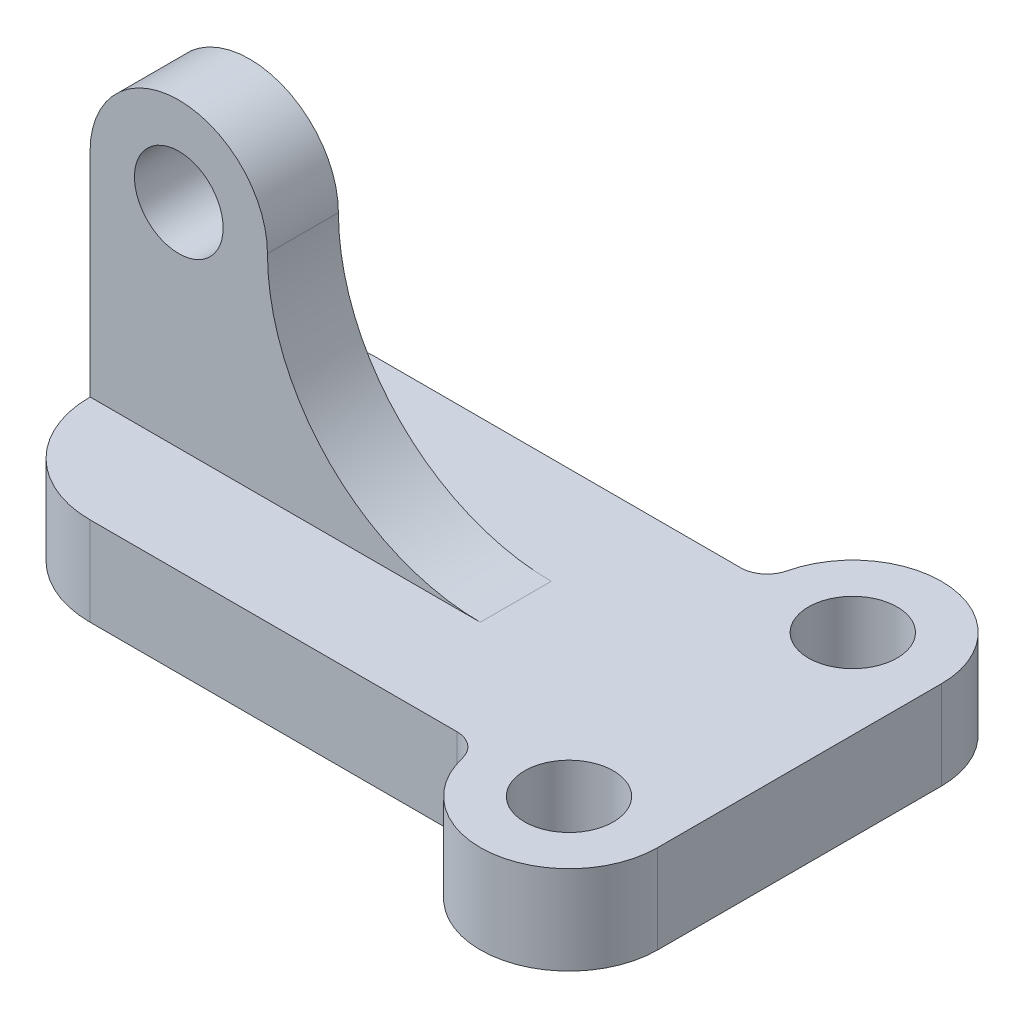
ISO-10303-21;
HEADER;
FILE_DESCRIPTION(('STEP AP214'),'2;1');
FILE_NAME('part.step','',(''),(''),'','','');
FILE_SCHEMA(('AUTOMOTIVE_DESIGN { 1 0 10303 214 1 1 1 1 }'));
ENDSEC;
DATA;
#1=APPLICATION_CONTEXT('core data for automotive mechanical design processes');
#2=APPLICATION_PROTOCOL_DEFINITION('international standard','automotive_design',2000,#1);
#3=PRODUCT_CONTEXT('',#1,'mechanical');
#4=PRODUCT('Part','Part','',(#3));
#5=PRODUCT_RELATED_PRODUCT_CATEGORY('part','',(#4));
#6=PRODUCT_DEFINITION_FORMATION('','',#4);
#7=PRODUCT_DEFINITION_CONTEXT('part definition',#1,'design');
#8=PRODUCT_DEFINITION('design','',#6,#7);
#9=PRODUCT_DEFINITION_SHAPE('','',#8);
#10=(LENGTH_UNIT() NAMED_UNIT(*) SI_UNIT(.MILLI.,.METRE.));
#11=(NAMED_UNIT(*) PLANE_ANGLE_UNIT() SI_UNIT($,.RADIAN.));
#12=(NAMED_UNIT(*) SI_UNIT($,.STERADIAN.) SOLID_ANGLE_UNIT());
#13=UNCERTAINTY_MEASURE_WITH_UNIT(LENGTH_MEASURE(1.E-05),#10,'distance_accuracy_value','');
#14=(GEOMETRIC_REPRESENTATION_CONTEXT(3) GLOBAL_UNCERTAINTY_ASSIGNED_CONTEXT((#13)) GLOBAL_UNIT_ASSIGNED_CONTEXT((#10,
#11,#12)) REPRESENTATION_CONTEXT('',''));
#15=CARTESIAN_POINT('',(0.,0.,0.));
#16=DIRECTION('',(0.,0.,1.));
#17=DIRECTION('',(1.,0.,0.));
#18=AXIS2_PLACEMENT_3D('',#15,#16,#17);
#19=CARTESIAN_POINT('',(44.,34.,-12.));
#20=DIRECTION('',(0.,0.,-1.));
#21=DIRECTION('',(-1.,0.,0.));
#22=AXIS2_PLACEMENT_3D('',#19,#20,#21);
#23=CYLINDRICAL_SURFACE('',#22,24.);
#24=DIRECTION('',(0.,0.,-1.));
#25=VECTOR('',#24,1.);
#26=CARTESIAN_POINT('',(44.,10.,0.));
#27=LINE('',#26,#25);
#28=CARTESIAN_POINT('',(44.,10.,-20.));
#29=VERTEX_POINT('',#28);
#30=CARTESIAN_POINT('',(44.,10.,-12.));
#31=VERTEX_POINT('',#30);
#32=EDGE_CURVE('E135',#29,#31,#27,.F.);
#33=ORIENTED_EDGE('',*,*,#32,.F.);
#34=CARTESIAN_POINT('',(44.,34.,-20.));
#35=DIRECTION('',(0.,0.,-1.));
#36=DIRECTION('',(-1.,0.,0.));
#37=AXIS2_PLACEMENT_3D('',#34,#35,#36);
#38=CIRCLE('',#37,24.);
#39=CARTESIAN_POINT('',(20.,34.,-20.));
#40=VERTEX_POINT('',#39);
#41=EDGE_CURVE('E11',#29,#40,#38,.T.);
#42=ORIENTED_EDGE('',*,*,#41,.T.);
#43=DIRECTION('',(0.,0.,-1.));
#44=VECTOR('',#43,1.);
#45=CARTESIAN_POINT('',(20.,34.,-12.));
#46=LINE('',#45,#44);
#47=CARTESIAN_POINT('',(20.,34.,-12.));
#48=VERTEX_POINT('',#47);
#49=EDGE_CURVE('E137',#48,#40,#46,.T.);
#50=ORIENTED_EDGE('',*,*,#49,.F.);
#51=CARTESIAN_POINT('',(44.,34.,-12.));
#52=DIRECTION('',(0.,0.,-1.));
#53=DIRECTION('',(-1.,0.,0.));
#54=AXIS2_PLACEMENT_3D('',#51,#52,#53);
#55=CIRCLE('',#54,24.);
#56=EDGE_CURVE('E43',#48,#31,#55,.F.);
#57=ORIENTED_EDGE('',*,*,#56,.T.);
#58=EDGE_LOOP('',(#33,#42,#50,#57));
#59=FACE_BOUND('',#58,.T.);
#60=ADVANCED_FACE('F36',(#59),#23,.F.);
#61=CARTESIAN_POINT('',(0.,10.,0.));
#62=DIRECTION('',(0.,1.,0.));
#63=DIRECTION('',(0.,0.,1.));
#64=AXIS2_PLACEMENT_3D('',#61,#62,#63);
#65=PLANE('',#64);
#66=CARTESIAN_POINT('',(66.,10.,0.));
#67=DIRECTION('',(0.,1.,0.));
#68=DIRECTION('',(0.,0.,1.));
#69=AXIS2_PLACEMENT_3D('',#66,#67,#68);
#70=CIRCLE('',#69,5.);
#71=CARTESIAN_POINT('',(66.,10.,5.));
#72=VERTEX_POINT('',#71);
#73=EDGE_CURVE('E163',#72,#72,#70,.F.);
#74=ORIENTED_EDGE('',*,*,#73,.T.);
#75=EDGE_LOOP('',(#74));
#76=FACE_BOUND('',#75,.T.);
#77=CARTESIAN_POINT('',(66.,10.,-32.));
#78=DIRECTION('',(0.,1.,0.));
#79=DIRECTION('',(0.,0.,1.));
#80=AXIS2_PLACEMENT_3D('',#77,#78,#79);
#81=CIRCLE('',#80,5.00000000000001);
#82=CARTESIAN_POINT('',(66.,10.,-27.));
#83=VERTEX_POINT('',#82);
#84=EDGE_CURVE('E160',#83,#83,#81,.T.);
#85=ORIENTED_EDGE('',*,*,#84,.F.);
#86=EDGE_LOOP('',(#85));
#87=FACE_BOUND('',#86,.T.);
#88=ORIENTED_EDGE('',*,*,#32,.T.);
#89=DIRECTION('',(1.,0.,0.));
#90=VECTOR('',#89,1.);
#91=CARTESIAN_POINT('',(0.,10.,-12.));
#92=LINE('',#91,#90);
#93=CARTESIAN_POINT('',(0.,10.,-12.));
#94=VERTEX_POINT('',#93);
#95=EDGE_CURVE('E50',#94,#31,#92,.T.);
#96=ORIENTED_EDGE('',*,*,#95,.F.);
#97=CARTESIAN_POINT('',(12.,10.,-12.));
#98=DIRECTION('',(0.,1.,0.));
#99=DIRECTION('',(0.,0.,1.));
#100=AXIS2_PLACEMENT_3D('',#97,#98,#99);
#101=CIRCLE('',#100,12.);
#102=CARTESIAN_POINT('',(12.,10.,0.));
#103=VERTEX_POINT('',#102);
#104=EDGE_CURVE('E242',#94,#103,#101,.T.);
#105=ORIENTED_EDGE('',*,*,#104,.T.);
#106=DIRECTION('',(1.,0.,0.));
#107=VECTOR('',#106,1.);
#108=CARTESIAN_POINT('',(0.,10.,0.));
#109=LINE('',#108,#107);
#110=CARTESIAN_POINT('',(53.3508893593265,10.,0.));
#111=VERTEX_POINT('',#110);
#112=EDGE_CURVE('E178',#103,#111,#109,.T.);
#113=ORIENTED_EDGE('',*,*,#112,.T.);
#114=CARTESIAN_POINT('',(53.3508893593265,10.,3.));
#115=DIRECTION('',(0.,1.,0.));
#116=DIRECTION('',(0.,0.,1.));
#117=AXIS2_PLACEMENT_3D('',#114,#115,#116);
#118=CIRCLE('',#117,3.);
#119=CARTESIAN_POINT('',(56.2699148917896,10.,2.3076923076923));
#120=VERTEX_POINT('',#119);
#121=EDGE_CURVE('E212',#120,#111,#118,.T.);
#122=ORIENTED_EDGE('',*,*,#121,.F.);
#123=CARTESIAN_POINT('',(66.,10.,0.));
#124=DIRECTION('',(0.,1.,0.));
#125=DIRECTION('',(0.,0.,1.));
#126=AXIS2_PLACEMENT_3D('',#123,#124,#125);
#127=CIRCLE('',#126,10.);
#128=CARTESIAN_POINT('',(76.,10.,0.));
#129=VERTEX_POINT('',#128);
#130=EDGE_CURVE('E167',#129,#120,#127,.F.);
#131=ORIENTED_EDGE('',*,*,#130,.F.);
#132=DIRECTION('',(0.,0.,1.));
#133=VECTOR('',#132,1.);
#134=CARTESIAN_POINT('',(76.,10.,0.));
#135=LINE('',#134,#133);
#136=CARTESIAN_POINT('',(76.,10.,-32.));
#137=VERTEX_POINT('',#136);
#138=EDGE_CURVE('E170',#137,#129,#135,.T.);
#139=ORIENTED_EDGE('',*,*,#138,.F.);
#140=CARTESIAN_POINT('',(66.,10.,-32.));
#141=DIRECTION('',(0.,1.,0.));
#142=DIRECTION('',(0.,0.,1.));
#143=AXIS2_PLACEMENT_3D('',#140,#141,#142);
#144=CIRCLE('',#143,10.);
#145=CARTESIAN_POINT('',(56.2699148917896,10.,-34.3076923076923));
#146=VERTEX_POINT('',#145);
#147=EDGE_CURVE('E173',#137,#146,#144,.T.);
#148=ORIENTED_EDGE('',*,*,#147,.T.);
#149=CARTESIAN_POINT('',(53.3508893593265,10.,-35.));
#150=DIRECTION('',(0.,1.,0.));
#151=DIRECTION('',(0.,0.,1.));
#152=AXIS2_PLACEMENT_3D('',#149,#150,#151);
#153=CIRCLE('',#152,3.);
#154=CARTESIAN_POINT('',(53.3508893593265,10.,-32.));
#155=VERTEX_POINT('',#154);
#156=EDGE_CURVE('E221',#155,#146,#153,.T.);
#157=ORIENTED_EDGE('',*,*,#156,.F.);
#158=DIRECTION('',(1.,0.,0.));
#159=VECTOR('',#158,1.);
#160=CARTESIAN_POINT('',(0.,10.,-32.));
#161=LINE('',#160,#159);
#162=CARTESIAN_POINT('',(12.,10.,-32.));
#163=VERTEX_POINT('',#162);
#164=EDGE_CURVE('E176',#163,#155,#161,.T.);
#165=ORIENTED_EDGE('',*,*,#164,.F.);
#166=CARTESIAN_POINT('',(12.,10.,-20.));
#167=DIRECTION('',(0.,1.,0.));
#168=DIRECTION('',(0.,0.,1.));
#169=AXIS2_PLACEMENT_3D('',#166,#167,#168);
#170=CIRCLE('',#169,12.);
#171=CARTESIAN_POINT('',(0.,10.,-20.));
#172=VERTEX_POINT('',#171);
#173=EDGE_CURVE('E234',#163,#172,#170,.T.);
#174=ORIENTED_EDGE('',*,*,#173,.T.);
#175=DIRECTION('',(1.,0.,0.));
#176=VECTOR('',#175,1.);
#177=CARTESIAN_POINT('',(0.,10.,-20.));
#178=LINE('',#177,#176);
#179=EDGE_CURVE('E58',#172,#29,#178,.T.);
#180=ORIENTED_EDGE('',*,*,#179,.T.);
#181=EDGE_LOOP('',(#88,#96,#105,#113,#122,#131,#139,#148,#157,#165,#174,#180));
#182=FACE_BOUND('',#181,.T.);
#183=ADVANCED_FACE('F246',(#76,#87,#182),#65,.T.);
#184=CARTESIAN_POINT('',(12.,10.,-12.));
#185=DIRECTION('',(0.,-1.,0.));
#186=DIRECTION('',(0.,0.,-1.));
#187=AXIS2_PLACEMENT_3D('',#184,#185,#186);
#188=CYLINDRICAL_SURFACE('',#187,12.);
#189=DIRECTION('',(0.,-1.,0.));
#190=VECTOR('',#189,1.);
#191=CARTESIAN_POINT('',(12.,10.,0.));
#192=LINE('',#191,#190);
#193=CARTESIAN_POINT('',(12.,0.,0.));
#194=VERTEX_POINT('',#193);
#195=EDGE_CURVE('E236',#103,#194,#192,.T.);
#196=ORIENTED_EDGE('',*,*,#195,.F.);
#197=ORIENTED_EDGE('',*,*,#104,.F.);
#198=DIRECTION('',(0.,-1.,0.));
#199=VECTOR('',#198,1.);
#200=CARTESIAN_POINT('',(0.,10.,-12.));
#201=LINE('',#200,#199);
#202=CARTESIAN_POINT('',(0.,0.,-12.));
#203=VERTEX_POINT('',#202);
#204=EDGE_CURVE('E239',#203,#94,#201,.F.);
#205=ORIENTED_EDGE('',*,*,#204,.F.);
#206=CARTESIAN_POINT('',(12.,0.,-12.));
#207=DIRECTION('',(0.,1.,0.));
#208=DIRECTION('',(0.,0.,1.));
#209=AXIS2_PLACEMENT_3D('',#206,#207,#208);
#210=CIRCLE('',#209,12.);
#211=EDGE_CURVE('E244',#194,#203,#210,.F.);
#212=ORIENTED_EDGE('',*,*,#211,.F.);
#213=EDGE_LOOP('',(#196,#197,#205,#212));
#214=FACE_BOUND('',#213,.T.);
#215=ADVANCED_FACE('F251',(#214),#188,.T.);
#216=CARTESIAN_POINT('',(12.,10.,-20.));
#217=DIRECTION('',(0.,-1.,0.));
#218=DIRECTION('',(0.,0.,-1.));
#219=AXIS2_PLACEMENT_3D('',#216,#217,#218);
#220=CYLINDRICAL_SURFACE('',#219,12.);
#221=DIRECTION('',(0.,1.,0.));
#222=VECTOR('',#221,1.);
#223=CARTESIAN_POINT('',(12.,10.,-32.));
#224=LINE('',#223,#222);
#225=CARTESIAN_POINT('',(12.,0.,-32.));
#226=VERTEX_POINT('',#225);
#227=EDGE_CURVE('E226',#226,#163,#224,.T.);
#228=ORIENTED_EDGE('',*,*,#227,.F.);
#229=CARTESIAN_POINT('',(12.,0.,-20.));
#230=DIRECTION('',(0.,1.,0.));
#231=DIRECTION('',(0.,0.,1.));
#232=AXIS2_PLACEMENT_3D('',#229,#230,#231);
#233=CIRCLE('',#232,12.);
#234=CARTESIAN_POINT('',(0.,0.,-20.));
#235=VERTEX_POINT('',#234);
#236=EDGE_CURVE('E232',#235,#226,#233,.F.);
#237=ORIENTED_EDGE('',*,*,#236,.F.);
#238=DIRECTION('',(0.,1.,0.));
#239=VECTOR('',#238,1.);
#240=CARTESIAN_POINT('',(0.,10.,-20.));
#241=LINE('',#240,#239);
#242=EDGE_CURVE('E229',#172,#235,#241,.F.);
#243=ORIENTED_EDGE('',*,*,#242,.F.);
#244=ORIENTED_EDGE('',*,*,#173,.F.);
#245=EDGE_LOOP('',(#228,#237,#243,#244));
#246=FACE_BOUND('',#245,.T.);
#247=ADVANCED_FACE('F290',(#246),#220,.T.);
#248=CARTESIAN_POINT('',(53.3508893593265,10.,-35.));
#249=DIRECTION('',(0.,-1.,0.));
#250=DIRECTION('',(0.,0.,-1.));
#251=AXIS2_PLACEMENT_3D('',#248,#249,#250);
#252=CYLINDRICAL_SURFACE('',#251,3.);
#253=DIRECTION('',(0.,-1.,0.));
#254=VECTOR('',#253,1.);
#255=CARTESIAN_POINT('',(53.3508893593265,10.,-32.));
#256=LINE('',#255,#254);
#257=CARTESIAN_POINT('',(53.3508893593265,0.,-32.));
#258=VERTEX_POINT('',#257);
#259=EDGE_CURVE('E215',#155,#258,#256,.T.);
#260=ORIENTED_EDGE('',*,*,#259,.F.);
#261=ORIENTED_EDGE('',*,*,#156,.T.);
#262=DIRECTION('',(0.,-1.,0.));
#263=VECTOR('',#262,1.);
#264=CARTESIAN_POINT('',(56.2699148917896,10.,-34.3076923076923));
#265=LINE('',#264,#263);
#266=CARTESIAN_POINT('',(56.2699148917896,0.,-34.3076923076923));
#267=VERTEX_POINT('',#266);
#268=EDGE_CURVE('E218',#267,#146,#265,.F.);
#269=ORIENTED_EDGE('',*,*,#268,.F.);
#270=CARTESIAN_POINT('',(53.3508893593265,0.,-35.));
#271=DIRECTION('',(0.,1.,0.));
#272=DIRECTION('',(0.,0.,1.));
#273=AXIS2_PLACEMENT_3D('',#270,#271,#272);
#274=CIRCLE('',#273,3.);
#275=EDGE_CURVE('E223',#267,#258,#274,.F.);
#276=ORIENTED_EDGE('',*,*,#275,.T.);
#277=EDGE_LOOP('',(#260,#261,#269,#276));
#278=FACE_BOUND('',#277,.T.);
#279=ADVANCED_FACE('F285',(#278),#252,.F.);
#280=CARTESIAN_POINT('',(53.3508893593265,10.,3.));
#281=DIRECTION('',(0.,-1.,0.));
#282=DIRECTION('',(0.,0.,-1.));
#283=AXIS2_PLACEMENT_3D('',#280,#281,#282);
#284=CYLINDRICAL_SURFACE('',#283,3.);
#285=DIRECTION('',(0.,-1.,0.));
#286=VECTOR('',#285,1.);
#287=CARTESIAN_POINT('',(53.3508893593265,10.,0.));
#288=LINE('',#287,#286);
#289=CARTESIAN_POINT('',(53.3508893593265,0.,0.));
#290=VERTEX_POINT('',#289);
#291=EDGE_CURVE('E204',#290,#111,#288,.F.);
#292=ORIENTED_EDGE('',*,*,#291,.F.);
#293=CARTESIAN_POINT('',(53.3508893593265,0.,3.));
#294=DIRECTION('',(0.,1.,0.));
#295=DIRECTION('',(0.,0.,1.));
#296=AXIS2_PLACEMENT_3D('',#293,#294,#295);
#297=CIRCLE('',#296,3.);
#298=CARTESIAN_POINT('',(56.2699148917896,0.,2.3076923076923));
#299=VERTEX_POINT('',#298);
#300=EDGE_CURVE('E210',#290,#299,#297,.F.);
#301=ORIENTED_EDGE('',*,*,#300,.T.);
#302=DIRECTION('',(0.,-1.,0.));
#303=VECTOR('',#302,1.);
#304=CARTESIAN_POINT('',(56.2699148917896,10.,2.30769230769231));
#305=LINE('',#304,#303);
#306=EDGE_CURVE('E207',#120,#299,#305,.T.);
#307=ORIENTED_EDGE('',*,*,#306,.F.);
#308=ORIENTED_EDGE('',*,*,#121,.T.);
#309=EDGE_LOOP('',(#292,#301,#307,#308));
#310=FACE_BOUND('',#309,.T.);
#311=ADVANCED_FACE('F268',(#310),#284,.F.);
#312=CARTESIAN_POINT('',(66.,10.,0.));
#313=DIRECTION('',(0.,-1.,0.));
#314=DIRECTION('',(0.,0.,-1.));
#315=AXIS2_PLACEMENT_3D('',#312,#313,#314);
#316=CYLINDRICAL_SURFACE('',#315,10.);
#317=ORIENTED_EDGE('',*,*,#130,.T.);
#318=ORIENTED_EDGE('',*,*,#306,.T.);
#319=CARTESIAN_POINT('',(66.,0.,0.));
#320=DIRECTION('',(0.,1.,0.));
#321=DIRECTION('',(0.,0.,1.));
#322=AXIS2_PLACEMENT_3D('',#319,#320,#321);
#323=CIRCLE('',#322,10.);
#324=CARTESIAN_POINT('',(76.,0.,0.));
#325=VERTEX_POINT('',#324);
#326=EDGE_CURVE('E186',#325,#299,#323,.F.);
#327=ORIENTED_EDGE('',*,*,#326,.F.);
#328=DIRECTION('',(0.,-1.,0.));
#329=VECTOR('',#328,1.);
#330=CARTESIAN_POINT('',(76.,10.,0.));
#331=LINE('',#330,#329);
#332=EDGE_CURVE('E202',#129,#325,#331,.T.);
#333=ORIENTED_EDGE('',*,*,#332,.F.);
#334=EDGE_LOOP('',(#317,#318,#327,#333));
#335=FACE_BOUND('',#334,.T.);
#336=ADVANCED_FACE('F271',(#335),#316,.T.);
#337=CARTESIAN_POINT('',(76.,10.,0.));
#338=DIRECTION('',(1.,0.,0.));
#339=DIRECTION('',(0.,0.,-1.));
#340=AXIS2_PLACEMENT_3D('',#337,#338,#339);
#341=PLANE('',#340);
#342=DIRECTION('',(0.,0.,1.));
#343=VECTOR('',#342,1.);
#344=CARTESIAN_POINT('',(76.,0.,0.));
#345=LINE('',#344,#343);
#346=CARTESIAN_POINT('',(76.,0.,-32.));
#347=VERTEX_POINT('',#346);
#348=EDGE_CURVE('E189',#347,#325,#345,.T.);
#349=ORIENTED_EDGE('',*,*,#348,.F.);
#350=DIRECTION('',(0.,-1.,0.));
#351=VECTOR('',#350,1.);
#352=CARTESIAN_POINT('',(76.,10.,-32.));
#353=LINE('',#352,#351);
#354=EDGE_CURVE('E180',#137,#347,#353,.T.);
#355=ORIENTED_EDGE('',*,*,#354,.F.);
#356=ORIENTED_EDGE('',*,*,#138,.T.);
#357=ORIENTED_EDGE('',*,*,#332,.T.);
#358=EDGE_LOOP('',(#349,#355,#356,#357));
#359=FACE_BOUND('',#358,.T.);
#360=ADVANCED_FACE('F275',(#359),#341,.T.);
#361=CARTESIAN_POINT('',(66.,10.,-32.));
#362=DIRECTION('',(0.,-1.,0.));
#363=DIRECTION('',(0.,0.,-1.));
#364=AXIS2_PLACEMENT_3D('',#361,#362,#363);
#365=CYLINDRICAL_SURFACE('',#364,10.);
#366=CARTESIAN_POINT('',(66.,0.,-32.));
#367=DIRECTION('',(0.,1.,0.));
#368=DIRECTION('',(0.,0.,1.));
#369=AXIS2_PLACEMENT_3D('',#366,#367,#368);
#370=CIRCLE('',#369,10.);
#371=EDGE_CURVE('E192',#347,#267,#370,.T.);
#372=ORIENTED_EDGE('',*,*,#371,.T.);
#373=ORIENTED_EDGE('',*,*,#268,.T.);
#374=ORIENTED_EDGE('',*,*,#147,.F.);
#375=ORIENTED_EDGE('',*,*,#354,.T.);
#376=EDGE_LOOP('',(#372,#373,#374,#375));
#377=FACE_BOUND('',#376,.T.);
#378=ADVANCED_FACE('F279',(#377),#365,.T.);
#379=CARTESIAN_POINT('',(0.,10.,-32.));
#380=DIRECTION('',(0.,0.,-1.));
#381=DIRECTION('',(-1.,0.,0.));
#382=AXIS2_PLACEMENT_3D('',#379,#380,#381);
#383=PLANE('',#382);
#384=DIRECTION('',(1.,0.,0.));
#385=VECTOR('',#384,1.);
#386=CARTESIAN_POINT('',(0.,0.,-32.));
#387=LINE('',#386,#385);
#388=EDGE_CURVE('E195',#226,#258,#387,.T.);
#389=ORIENTED_EDGE('',*,*,#388,.F.);
#390=ORIENTED_EDGE('',*,*,#227,.T.);
#391=ORIENTED_EDGE('',*,*,#164,.T.);
#392=ORIENTED_EDGE('',*,*,#259,.T.);
#393=EDGE_LOOP('',(#389,#390,#391,#392));
#394=FACE_BOUND('',#393,.T.);
#395=ADVANCED_FACE('F288',(#394),#383,.T.);
#396=CARTESIAN_POINT('',(0.,10.,0.));
#397=DIRECTION('',(1.,0.,0.));
#398=DIRECTION('',(0.,0.,-1.));
#399=AXIS2_PLACEMENT_3D('',#396,#397,#398);
#400=PLANE('',#399);
#401=DIRECTION('',(0.,0.,1.));
#402=VECTOR('',#401,1.);
#403=CARTESIAN_POINT('',(0.,0.,0.));
#404=LINE('',#403,#402);
#405=EDGE_CURVE('E197',#235,#203,#404,.T.);
#406=ORIENTED_EDGE('',*,*,#405,.T.);
#407=ORIENTED_EDGE('',*,*,#204,.T.);
#408=DIRECTION('',(0.,-1.,0.));
#409=VECTOR('',#408,1.);
#410=CARTESIAN_POINT('',(0.,10.,-12.));
#411=LINE('',#410,#409);
#412=CARTESIAN_POINT('',(0.,34.,-12.));
#413=VERTEX_POINT('',#412);
#414=EDGE_CURVE('E146',#413,#94,#411,.T.);
#415=ORIENTED_EDGE('',*,*,#414,.F.);
#416=DIRECTION('',(0.,0.,-1.));
#417=VECTOR('',#416,1.);
#418=CARTESIAN_POINT('',(0.,34.,-12.));
#419=LINE('',#418,#417);
#420=CARTESIAN_POINT('',(0.,34.,-20.));
#421=VERTEX_POINT('',#420);
#422=EDGE_CURVE('E141',#413,#421,#419,.T.);
#423=ORIENTED_EDGE('',*,*,#422,.T.);
#424=DIRECTION('',(0.,-1.,0.));
#425=VECTOR('',#424,1.);
#426=CARTESIAN_POINT('',(0.,10.,-20.));
#427=LINE('',#426,#425);
#428=EDGE_CURVE('E149',#421,#172,#427,.T.);
#429=ORIENTED_EDGE('',*,*,#428,.T.);
#430=ORIENTED_EDGE('',*,*,#242,.T.);
#431=EDGE_LOOP('',(#406,#407,#415,#423,#429,#430));
#432=FACE_BOUND('',#431,.T.);
#433=ADVANCED_FACE('F254',(#432),#400,.F.);
#434=CARTESIAN_POINT('',(66.,10.,0.));
#435=DIRECTION('',(0.,-1.,0.));
#436=DIRECTION('',(0.,0.,-1.));
#437=AXIS2_PLACEMENT_3D('',#434,#435,#436);
#438=CYLINDRICAL_SURFACE('',#437,5.);
#439=ORIENTED_EDGE('',*,*,#73,.F.);
#440=EDGE_LOOP('',(#439));
#441=FACE_BOUND('',#440,.T.);
#442=CARTESIAN_POINT('',(66.,0.,0.));
#443=DIRECTION('',(0.,1.,0.));
#444=DIRECTION('',(0.,0.,1.));
#445=AXIS2_PLACEMENT_3D('',#442,#443,#444);
#446=CIRCLE('',#445,5.);
#447=CARTESIAN_POINT('',(66.,0.,5.));
#448=VERTEX_POINT('',#447);
#449=EDGE_CURVE('E183',#448,#448,#446,.F.);
#450=ORIENTED_EDGE('',*,*,#449,.T.);
#451=EDGE_LOOP('',(#450));
#452=FACE_BOUND('',#451,.T.);
#453=ADVANCED_FACE('F331',(#441,#452),#438,.F.);
#454=CARTESIAN_POINT('',(66.,10.,-32.));
#455=DIRECTION('',(0.,-1.,0.));
#456=DIRECTION('',(0.,0.,-1.));
#457=AXIS2_PLACEMENT_3D('',#454,#455,#456);
#458=CYLINDRICAL_SURFACE('',#457,5.00000000000001);
#459=ORIENTED_EDGE('',*,*,#84,.T.);
#460=EDGE_LOOP('',(#459));
#461=FACE_BOUND('',#460,.T.);
#462=CARTESIAN_POINT('',(66.,0.,-32.));
#463=DIRECTION('',(0.,1.,0.));
#464=DIRECTION('',(0.,0.,1.));
#465=AXIS2_PLACEMENT_3D('',#462,#463,#464);
#466=CIRCLE('',#465,5.00000000000001);
#467=CARTESIAN_POINT('',(66.,0.,-27.));
#468=VERTEX_POINT('',#467);
#469=EDGE_CURVE('E140',#468,#468,#466,.T.);
#470=ORIENTED_EDGE('',*,*,#469,.F.);
#471=EDGE_LOOP('',(#470));
#472=FACE_BOUND('',#471,.T.);
#473=ADVANCED_FACE('F328',(#461,#472),#458,.F.);
#474=CARTESIAN_POINT('',(0.,10.,0.));
#475=DIRECTION('',(0.,0.,-1.));
#476=DIRECTION('',(-1.,0.,0.));
#477=AXIS2_PLACEMENT_3D('',#474,#475,#476);
#478=PLANE('',#477);
#479=ORIENTED_EDGE('',*,*,#112,.F.);
#480=ORIENTED_EDGE('',*,*,#195,.T.);
#481=DIRECTION('',(1.,0.,0.));
#482=VECTOR('',#481,1.);
#483=CARTESIAN_POINT('',(0.,0.,0.));
#484=LINE('',#483,#482);
#485=EDGE_CURVE('E164',#194,#290,#484,.T.);
#486=ORIENTED_EDGE('',*,*,#485,.T.);
#487=ORIENTED_EDGE('',*,*,#291,.T.);
#488=EDGE_LOOP('',(#479,#480,#486,#487));
#489=FACE_BOUND('',#488,.T.);
#490=ADVANCED_FACE('F263',(#489),#478,.F.);
#491=CARTESIAN_POINT('',(0.,0.,0.));
#492=DIRECTION('',(0.,1.,0.));
#493=DIRECTION('',(0.,0.,1.));
#494=AXIS2_PLACEMENT_3D('',#491,#492,#493);
#495=PLANE('',#494);
#496=ORIENTED_EDGE('',*,*,#469,.T.);
#497=EDGE_LOOP('',(#496));
#498=FACE_BOUND('',#497,.T.);
#499=ORIENTED_EDGE('',*,*,#449,.F.);
#500=EDGE_LOOP('',(#499));
#501=FACE_BOUND('',#500,.T.);
#502=ORIENTED_EDGE('',*,*,#485,.F.);
#503=ORIENTED_EDGE('',*,*,#211,.T.);
#504=ORIENTED_EDGE('',*,*,#405,.F.);
#505=ORIENTED_EDGE('',*,*,#236,.T.);
#506=ORIENTED_EDGE('',*,*,#388,.T.);
#507=ORIENTED_EDGE('',*,*,#275,.F.);
#508=ORIENTED_EDGE('',*,*,#371,.F.);
#509=ORIENTED_EDGE('',*,*,#348,.T.);
#510=ORIENTED_EDGE('',*,*,#326,.T.);
#511=ORIENTED_EDGE('',*,*,#300,.F.);
#512=EDGE_LOOP('',(#502,#503,#504,#505,#506,#507,#508,#509,#510,#511));
#513=FACE_BOUND('',#512,.T.);
#514=ADVANCED_FACE('F259',(#498,#501,#513),#495,.F.);
#515=CARTESIAN_POINT('',(9.99999999999996,34.,-12.));
#516=DIRECTION('',(0.,0.,-1.));
#517=DIRECTION('',(-1.,0.,0.));
#518=AXIS2_PLACEMENT_3D('',#515,#516,#517);
#519=PLANE('',#518);
#520=ORIENTED_EDGE('',*,*,#95,.T.);
#521=ORIENTED_EDGE('',*,*,#56,.F.);
#522=CARTESIAN_POINT('',(9.99999999999996,34.,-12.));
#523=DIRECTION('',(0.,0.,1.));
#524=DIRECTION('',(-1.,0.,0.));
#525=AXIS2_PLACEMENT_3D('',#522,#523,#524);
#526=CIRCLE('',#525,10.);
#527=EDGE_CURVE('E131',#48,#413,#526,.T.);
#528=ORIENTED_EDGE('',*,*,#527,.T.);
#529=ORIENTED_EDGE('',*,*,#414,.T.);
#530=EDGE_LOOP('',(#520,#521,#528,#529));
#531=FACE_BOUND('',#530,.T.);
#532=CARTESIAN_POINT('',(9.99999999999996,34.,-12.));
#533=DIRECTION('',(0.,0.,1.));
#534=DIRECTION('',(1.,0.,0.));
#535=AXIS2_PLACEMENT_3D('',#532,#533,#534);
#536=CIRCLE('',#535,5.);
#537=CARTESIAN_POINT('',(15.,34.,-12.));
#538=VERTEX_POINT('',#537);
#539=EDGE_CURVE('E155',#538,#538,#536,.T.);
#540=ORIENTED_EDGE('',*,*,#539,.F.);
#541=EDGE_LOOP('',(#540));
#542=FACE_BOUND('',#541,.T.);
#543=ADVANCED_FACE('F128',(#531,#542),#519,.F.);
#544=CARTESIAN_POINT('',(9.99999999999996,34.,-20.));
#545=DIRECTION('',(0.,0.,-1.));
#546=DIRECTION('',(-1.,0.,0.));
#547=AXIS2_PLACEMENT_3D('',#544,#545,#546);
#548=PLANE('',#547);
#549=ORIENTED_EDGE('',*,*,#179,.F.);
#550=ORIENTED_EDGE('',*,*,#428,.F.);
#551=CARTESIAN_POINT('',(9.99999999999996,34.,-20.));
#552=DIRECTION('',(0.,0.,1.));
#553=DIRECTION('',(-1.,0.,0.));
#554=AXIS2_PLACEMENT_3D('',#551,#552,#553);
#555=CIRCLE('',#554,10.);
#556=EDGE_CURVE('E154',#40,#421,#555,.T.);
#557=ORIENTED_EDGE('',*,*,#556,.F.);
#558=ORIENTED_EDGE('',*,*,#41,.F.);
#559=EDGE_LOOP('',(#549,#550,#557,#558));
#560=FACE_BOUND('',#559,.T.);
#561=CARTESIAN_POINT('',(9.99999999999996,34.,-20.));
#562=DIRECTION('',(0.,0.,1.));
#563=DIRECTION('',(1.,0.,0.));
#564=AXIS2_PLACEMENT_3D('',#561,#562,#563);
#565=CIRCLE('',#564,5.);
#566=CARTESIAN_POINT('',(15.,34.,-20.));
#567=VERTEX_POINT('',#566);
#568=EDGE_CURVE('E299',#567,#567,#565,.T.);
#569=ORIENTED_EDGE('',*,*,#568,.T.);
#570=EDGE_LOOP('',(#569));
#571=FACE_BOUND('',#570,.T.);
#572=ADVANCED_FACE('F293',(#560,#571),#548,.T.);
#573=CARTESIAN_POINT('',(9.99999999999996,34.,-12.));
#574=DIRECTION('',(0.,0.,-1.));
#575=DIRECTION('',(-1.,0.,0.));
#576=AXIS2_PLACEMENT_3D('',#573,#574,#575);
#577=CYLINDRICAL_SURFACE('',#576,10.);
#578=ORIENTED_EDGE('',*,*,#556,.T.);
#579=ORIENTED_EDGE('',*,*,#422,.F.);
#580=ORIENTED_EDGE('',*,*,#527,.F.);
#581=ORIENTED_EDGE('',*,*,#49,.T.);
#582=EDGE_LOOP('',(#578,#579,#580,#581));
#583=FACE_BOUND('',#582,.T.);
#584=ADVANCED_FACE('F143',(#583),#577,.T.);
#585=CARTESIAN_POINT('',(9.99999999999996,34.,-12.));
#586=DIRECTION('',(0.,0.,-1.));
#587=DIRECTION('',(-1.,0.,0.));
#588=AXIS2_PLACEMENT_3D('',#585,#586,#587);
#589=CYLINDRICAL_SURFACE('',#588,5.);
#590=ORIENTED_EDGE('',*,*,#539,.T.);
#591=EDGE_LOOP('',(#590));
#592=FACE_BOUND('',#591,.T.);
#593=ORIENTED_EDGE('',*,*,#568,.F.);
#594=EDGE_LOOP('',(#593));
#595=FACE_BOUND('',#594,.T.);
#596=ADVANCED_FACE('F305',(#592,#595),#589,.F.);
#597=CLOSED_SHELL('',(#60,#183,#215,#247,#279,#311,#336,#360,#378,#395,#433,#453,#473,#490,#514,
#543,#572,#584,#596));
#598=MANIFOLD_SOLID_BREP('B2',#597);
#599=ADVANCED_BREP_SHAPE_REPRESENTATION('',(#18,#598),#14);
#600=SHAPE_DEFINITION_REPRESENTATION(#9,#599);
ENDSEC;
END-ISO-10303-21;
